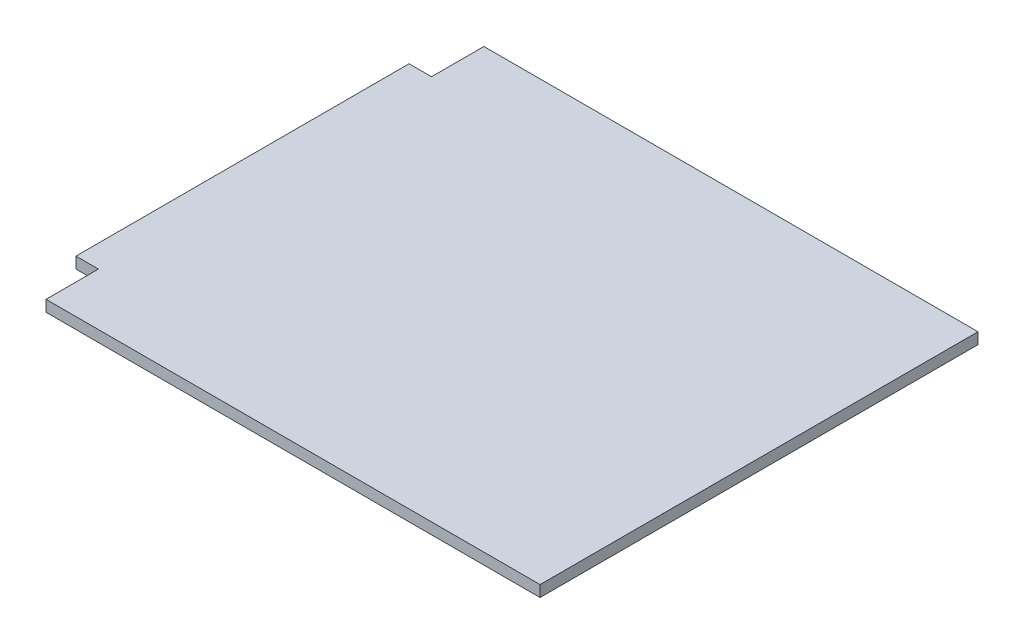
ISO-10303-21;
HEADER;
FILE_DESCRIPTION(('STEP AP214'),'2;1');
FILE_NAME('part.step','',(''),(''),'','','');
FILE_SCHEMA(('AUTOMOTIVE_DESIGN { 1 0 10303 214 1 1 1 1 }'));
ENDSEC;
DATA;
#1=APPLICATION_CONTEXT('core data for automotive mechanical design processes');
#2=APPLICATION_PROTOCOL_DEFINITION('international standard','automotive_design',2000,#1);
#3=PRODUCT_CONTEXT('',#1,'mechanical');
#4=PRODUCT('Part','Part','',(#3));
#5=PRODUCT_RELATED_PRODUCT_CATEGORY('part','',(#4));
#6=PRODUCT_DEFINITION_FORMATION('','',#4);
#7=PRODUCT_DEFINITION_CONTEXT('part definition',#1,'design');
#8=PRODUCT_DEFINITION('design','',#6,#7);
#9=PRODUCT_DEFINITION_SHAPE('','',#8);
#10=(LENGTH_UNIT() NAMED_UNIT(*) SI_UNIT(.MILLI.,.METRE.));
#11=(NAMED_UNIT(*) PLANE_ANGLE_UNIT() SI_UNIT($,.RADIAN.));
#12=(NAMED_UNIT(*) SI_UNIT($,.STERADIAN.) SOLID_ANGLE_UNIT());
#13=UNCERTAINTY_MEASURE_WITH_UNIT(LENGTH_MEASURE(1.E-05),#10,'distance_accuracy_value','');
#14=(GEOMETRIC_REPRESENTATION_CONTEXT(3) GLOBAL_UNCERTAINTY_ASSIGNED_CONTEXT((#13)) GLOBAL_UNIT_ASSIGNED_CONTEXT((#10,
#11,#12)) REPRESENTATION_CONTEXT('',''));
#15=CARTESIAN_POINT('',(0.,0.,0.));
#16=DIRECTION('',(0.,0.,1.));
#17=DIRECTION('',(1.,0.,0.));
#18=AXIS2_PLACEMENT_3D('',#15,#16,#17);
#19=CARTESIAN_POINT('',(0.,19.05,565.15));
#20=DIRECTION('',(1.,0.,0.));
#21=DIRECTION('',(0.,0.,-1.));
#22=AXIS2_PLACEMENT_3D('',#19,#20,#21);
#23=PLANE('',#22);
#24=DIRECTION('',(0.,0.,1.));
#25=VECTOR('',#24,1.);
#26=CARTESIAN_POINT('',(0.,0.,565.15));
#27=LINE('',#26,#25);
#28=CARTESIAN_POINT('',(0.,0.,0.));
#29=VERTEX_POINT('',#28);
#30=CARTESIAN_POINT('',(0.,0.,565.15));
#31=VERTEX_POINT('',#30);
#32=EDGE_CURVE('E140',#29,#31,#27,.T.);
#33=ORIENTED_EDGE('',*,*,#32,.T.);
#34=DIRECTION('',(0.,-1.,0.));
#35=VECTOR('',#34,1.);
#36=CARTESIAN_POINT('',(0.,19.05,565.15));
#37=LINE('',#36,#35);
#38=CARTESIAN_POINT('',(0.,19.05,565.15));
#39=VERTEX_POINT('',#38);
#40=EDGE_CURVE('E11',#39,#31,#37,.T.);
#41=ORIENTED_EDGE('',*,*,#40,.F.);
#42=DIRECTION('',(0.,0.,1.));
#43=VECTOR('',#42,1.);
#44=CARTESIAN_POINT('',(0.,19.05,565.15));
#45=LINE('',#44,#43);
#46=CARTESIAN_POINT('',(0.,19.05,0.));
#47=VERTEX_POINT('',#46);
#48=EDGE_CURVE('E162',#47,#39,#45,.T.);
#49=ORIENTED_EDGE('',*,*,#48,.F.);
#50=DIRECTION('',(0.,-1.,0.));
#51=VECTOR('',#50,1.);
#52=CARTESIAN_POINT('',(0.,19.05,0.));
#53=LINE('',#52,#51);
#54=EDGE_CURVE('E136',#47,#29,#53,.T.);
#55=ORIENTED_EDGE('',*,*,#54,.T.);
#56=EDGE_LOOP('',(#33,#41,#49,#55));
#57=FACE_BOUND('',#56,.T.);
#58=ADVANCED_FACE('F39',(#57),#23,.F.);
#59=CARTESIAN_POINT('',(38.1,19.05,565.15));
#60=DIRECTION('',(0.,0.,-1.));
#61=DIRECTION('',(-1.,0.,0.));
#62=AXIS2_PLACEMENT_3D('',#59,#60,#61);
#63=PLANE('',#62);
#64=DIRECTION('',(1.,0.,0.));
#65=VECTOR('',#64,1.);
#66=CARTESIAN_POINT('',(38.1,0.,565.15));
#67=LINE('',#66,#65);
#68=CARTESIAN_POINT('',(38.1,0.,565.15));
#69=VERTEX_POINT('',#68);
#70=EDGE_CURVE('E144',#31,#69,#67,.T.);
#71=ORIENTED_EDGE('',*,*,#70,.T.);
#72=DIRECTION('',(0.,-1.,0.));
#73=VECTOR('',#72,1.);
#74=CARTESIAN_POINT('',(38.1,19.05,565.15));
#75=LINE('',#74,#73);
#76=CARTESIAN_POINT('',(38.1,19.05,565.15));
#77=VERTEX_POINT('',#76);
#78=EDGE_CURVE('E48',#77,#69,#75,.T.);
#79=ORIENTED_EDGE('',*,*,#78,.F.);
#80=DIRECTION('',(1.,0.,0.));
#81=VECTOR('',#80,1.);
#82=CARTESIAN_POINT('',(38.1,19.05,565.15));
#83=LINE('',#82,#81);
#84=EDGE_CURVE('E99',#39,#77,#83,.T.);
#85=ORIENTED_EDGE('',*,*,#84,.F.);
#86=ORIENTED_EDGE('',*,*,#40,.T.);
#87=EDGE_LOOP('',(#71,#79,#85,#86));
#88=FACE_BOUND('',#87,.T.);
#89=ADVANCED_FACE('F208',(#88),#63,.F.);
#90=CARTESIAN_POINT('',(38.1,19.05,654.05));
#91=DIRECTION('',(1.,0.,0.));
#92=DIRECTION('',(0.,0.,-1.));
#93=AXIS2_PLACEMENT_3D('',#90,#91,#92);
#94=PLANE('',#93);
#95=DIRECTION('',(0.,0.,1.));
#96=VECTOR('',#95,1.);
#97=CARTESIAN_POINT('',(38.1,0.,654.05));
#98=LINE('',#97,#96);
#99=CARTESIAN_POINT('',(38.1,0.,654.05));
#100=VERTEX_POINT('',#99);
#101=EDGE_CURVE('E147',#69,#100,#98,.T.);
#102=ORIENTED_EDGE('',*,*,#101,.T.);
#103=DIRECTION('',(0.,-1.,0.));
#104=VECTOR('',#103,1.);
#105=CARTESIAN_POINT('',(38.1,19.05,654.05));
#106=LINE('',#105,#104);
#107=CARTESIAN_POINT('',(38.1,19.05,654.05));
#108=VERTEX_POINT('',#107);
#109=EDGE_CURVE('E173',#108,#100,#106,.T.);
#110=ORIENTED_EDGE('',*,*,#109,.F.);
#111=DIRECTION('',(0.,0.,1.));
#112=VECTOR('',#111,1.);
#113=CARTESIAN_POINT('',(38.1,19.05,654.05));
#114=LINE('',#113,#112);
#115=EDGE_CURVE('E183',#77,#108,#114,.T.);
#116=ORIENTED_EDGE('',*,*,#115,.F.);
#117=ORIENTED_EDGE('',*,*,#78,.T.);
#118=EDGE_LOOP('',(#102,#110,#116,#117));
#119=FACE_BOUND('',#118,.T.);
#120=ADVANCED_FACE('F181',(#119),#94,.F.);
#121=CARTESIAN_POINT('',(876.3,19.05,654.05));
#122=DIRECTION('',(0.,0.,-1.));
#123=DIRECTION('',(-1.,0.,0.));
#124=AXIS2_PLACEMENT_3D('',#121,#122,#123);
#125=PLANE('',#124);
#126=DIRECTION('',(1.,0.,0.));
#127=VECTOR('',#126,1.);
#128=CARTESIAN_POINT('',(876.3,0.,654.05));
#129=LINE('',#128,#127);
#130=CARTESIAN_POINT('',(876.3,0.,654.05));
#131=VERTEX_POINT('',#130);
#132=EDGE_CURVE('E150',#100,#131,#129,.T.);
#133=ORIENTED_EDGE('',*,*,#132,.T.);
#134=DIRECTION('',(0.,-1.,0.));
#135=VECTOR('',#134,1.);
#136=CARTESIAN_POINT('',(876.3,19.05,654.05));
#137=LINE('',#136,#135);
#138=CARTESIAN_POINT('',(876.3,19.05,654.05));
#139=VERTEX_POINT('',#138);
#140=EDGE_CURVE('E169',#139,#131,#137,.T.);
#141=ORIENTED_EDGE('',*,*,#140,.F.);
#142=DIRECTION('',(1.,0.,0.));
#143=VECTOR('',#142,1.);
#144=CARTESIAN_POINT('',(876.3,19.05,654.05));
#145=LINE('',#144,#143);
#146=EDGE_CURVE('E196',#108,#139,#145,.T.);
#147=ORIENTED_EDGE('',*,*,#146,.F.);
#148=ORIENTED_EDGE('',*,*,#109,.T.);
#149=EDGE_LOOP('',(#133,#141,#147,#148));
#150=FACE_BOUND('',#149,.T.);
#151=ADVANCED_FACE('F191',(#150),#125,.F.);
#152=CARTESIAN_POINT('',(876.3,19.05,-88.9));
#153=DIRECTION('',(-1.,0.,0.));
#154=DIRECTION('',(0.,0.,1.));
#155=AXIS2_PLACEMENT_3D('',#152,#153,#154);
#156=PLANE('',#155);
#157=DIRECTION('',(0.,0.,-1.));
#158=VECTOR('',#157,1.);
#159=CARTESIAN_POINT('',(876.3,0.,-88.9));
#160=LINE('',#159,#158);
#161=CARTESIAN_POINT('',(876.3,0.,-88.9));
#162=VERTEX_POINT('',#161);
#163=EDGE_CURVE('E153',#131,#162,#160,.T.);
#164=ORIENTED_EDGE('',*,*,#163,.T.);
#165=DIRECTION('',(0.,-1.,0.));
#166=VECTOR('',#165,1.);
#167=CARTESIAN_POINT('',(876.3,19.05,-88.9));
#168=LINE('',#167,#166);
#169=CARTESIAN_POINT('',(876.3,19.05,-88.9));
#170=VERTEX_POINT('',#169);
#171=EDGE_CURVE('E129',#170,#162,#168,.T.);
#172=ORIENTED_EDGE('',*,*,#171,.F.);
#173=DIRECTION('',(0.,0.,-1.));
#174=VECTOR('',#173,1.);
#175=CARTESIAN_POINT('',(876.3,19.05,-88.9));
#176=LINE('',#175,#174);
#177=EDGE_CURVE('E118',#139,#170,#176,.T.);
#178=ORIENTED_EDGE('',*,*,#177,.F.);
#179=ORIENTED_EDGE('',*,*,#140,.T.);
#180=EDGE_LOOP('',(#164,#172,#178,#179));
#181=FACE_BOUND('',#180,.T.);
#182=ADVANCED_FACE('F194',(#181),#156,.F.);
#183=CARTESIAN_POINT('',(38.1,19.05,-88.9));
#184=DIRECTION('',(0.,0.,1.));
#185=DIRECTION('',(1.,0.,0.));
#186=AXIS2_PLACEMENT_3D('',#183,#184,#185);
#187=PLANE('',#186);
#188=DIRECTION('',(-1.,0.,0.));
#189=VECTOR('',#188,1.);
#190=CARTESIAN_POINT('',(38.1,0.,-88.9));
#191=LINE('',#190,#189);
#192=CARTESIAN_POINT('',(38.1,0.,-88.9));
#193=VERTEX_POINT('',#192);
#194=EDGE_CURVE('E127',#162,#193,#191,.T.);
#195=ORIENTED_EDGE('',*,*,#194,.T.);
#196=DIRECTION('',(0.,-1.,0.));
#197=VECTOR('',#196,1.);
#198=CARTESIAN_POINT('',(38.1,19.05,-88.9));
#199=LINE('',#198,#197);
#200=CARTESIAN_POINT('',(38.1,19.05,-88.9));
#201=VERTEX_POINT('',#200);
#202=EDGE_CURVE('E124',#201,#193,#199,.T.);
#203=ORIENTED_EDGE('',*,*,#202,.F.);
#204=DIRECTION('',(-1.,0.,0.));
#205=VECTOR('',#204,1.);
#206=CARTESIAN_POINT('',(38.1,19.05,-88.9));
#207=LINE('',#206,#205);
#208=EDGE_CURVE('E112',#170,#201,#207,.T.);
#209=ORIENTED_EDGE('',*,*,#208,.F.);
#210=ORIENTED_EDGE('',*,*,#171,.T.);
#211=EDGE_LOOP('',(#195,#203,#209,#210));
#212=FACE_BOUND('',#211,.T.);
#213=ADVANCED_FACE('F125',(#212),#187,.F.);
#214=CARTESIAN_POINT('',(38.1,19.05,0.));
#215=DIRECTION('',(1.,0.,0.));
#216=DIRECTION('',(0.,0.,-1.));
#217=AXIS2_PLACEMENT_3D('',#214,#215,#216);
#218=PLANE('',#217);
#219=DIRECTION('',(0.,0.,1.));
#220=VECTOR('',#219,1.);
#221=CARTESIAN_POINT('',(38.1,0.,0.));
#222=LINE('',#221,#220);
#223=CARTESIAN_POINT('',(38.1,0.,0.));
#224=VERTEX_POINT('',#223);
#225=EDGE_CURVE('E85',#193,#224,#222,.T.);
#226=ORIENTED_EDGE('',*,*,#225,.T.);
#227=DIRECTION('',(0.,-1.,0.));
#228=VECTOR('',#227,1.);
#229=CARTESIAN_POINT('',(38.1,19.05,0.));
#230=LINE('',#229,#228);
#231=CARTESIAN_POINT('',(38.1,19.05,0.));
#232=VERTEX_POINT('',#231);
#233=EDGE_CURVE('E130',#232,#224,#230,.T.);
#234=ORIENTED_EDGE('',*,*,#233,.F.);
#235=DIRECTION('',(0.,0.,1.));
#236=VECTOR('',#235,1.);
#237=CARTESIAN_POINT('',(38.1,19.05,0.));
#238=LINE('',#237,#236);
#239=EDGE_CURVE('E116',#201,#232,#238,.T.);
#240=ORIENTED_EDGE('',*,*,#239,.F.);
#241=ORIENTED_EDGE('',*,*,#202,.T.);
#242=EDGE_LOOP('',(#226,#234,#240,#241));
#243=FACE_BOUND('',#242,.T.);
#244=ADVANCED_FACE('F132',(#243),#218,.F.);
#245=CARTESIAN_POINT('',(0.,19.05,0.));
#246=DIRECTION('',(0.,0.,1.));
#247=DIRECTION('',(1.,0.,0.));
#248=AXIS2_PLACEMENT_3D('',#245,#246,#247);
#249=PLANE('',#248);
#250=DIRECTION('',(-1.,0.,0.));
#251=VECTOR('',#250,1.);
#252=CARTESIAN_POINT('',(0.,0.,0.));
#253=LINE('',#252,#251);
#254=EDGE_CURVE('E91',#224,#29,#253,.T.);
#255=ORIENTED_EDGE('',*,*,#254,.T.);
#256=ORIENTED_EDGE('',*,*,#54,.F.);
#257=DIRECTION('',(-1.,0.,0.));
#258=VECTOR('',#257,1.);
#259=CARTESIAN_POINT('',(0.,19.05,0.));
#260=LINE('',#259,#258);
#261=EDGE_CURVE('E56',#232,#47,#260,.T.);
#262=ORIENTED_EDGE('',*,*,#261,.F.);
#263=ORIENTED_EDGE('',*,*,#233,.T.);
#264=EDGE_LOOP('',(#255,#256,#262,#263));
#265=FACE_BOUND('',#264,.T.);
#266=ADVANCED_FACE('F224',(#265),#249,.F.);
#267=CARTESIAN_POINT('',(0.,19.05,0.));
#268=DIRECTION('',(0.,-1.,0.));
#269=DIRECTION('',(0.,0.,-1.));
#270=AXIS2_PLACEMENT_3D('',#267,#268,#269);
#271=PLANE('',#270);
#272=ORIENTED_EDGE('',*,*,#48,.T.);
#273=ORIENTED_EDGE('',*,*,#84,.T.);
#274=ORIENTED_EDGE('',*,*,#115,.T.);
#275=ORIENTED_EDGE('',*,*,#146,.T.);
#276=ORIENTED_EDGE('',*,*,#177,.T.);
#277=ORIENTED_EDGE('',*,*,#208,.T.);
#278=ORIENTED_EDGE('',*,*,#239,.T.);
#279=ORIENTED_EDGE('',*,*,#261,.T.);
#280=EDGE_LOOP('',(#272,#273,#274,#275,#276,#277,#278,#279));
#281=FACE_BOUND('',#280,.T.);
#282=ADVANCED_FACE('F114',(#281),#271,.F.);
#283=CARTESIAN_POINT('',(0.,0.,0.));
#284=DIRECTION('',(0.,-1.,0.));
#285=DIRECTION('',(0.,0.,-1.));
#286=AXIS2_PLACEMENT_3D('',#283,#284,#285);
#287=PLANE('',#286);
#288=ORIENTED_EDGE('',*,*,#32,.F.);
#289=ORIENTED_EDGE('',*,*,#254,.F.);
#290=ORIENTED_EDGE('',*,*,#225,.F.);
#291=ORIENTED_EDGE('',*,*,#194,.F.);
#292=ORIENTED_EDGE('',*,*,#163,.F.);
#293=ORIENTED_EDGE('',*,*,#132,.F.);
#294=ORIENTED_EDGE('',*,*,#101,.F.);
#295=ORIENTED_EDGE('',*,*,#70,.F.);
#296=EDGE_LOOP('',(#288,#289,#290,#291,#292,#293,#294,#295));
#297=FACE_BOUND('',#296,.T.);
#298=ADVANCED_FACE('F187',(#297),#287,.T.);
#299=CLOSED_SHELL('',(#58,#89,#120,#151,#182,#213,#244,#266,#282,#298));
#300=MANIFOLD_SOLID_BREP('B2',#299);
#301=ADVANCED_BREP_SHAPE_REPRESENTATION('',(#18,#300),#14);
#302=SHAPE_DEFINITION_REPRESENTATION(#9,#301);
ENDSEC;
END-ISO-10303-21;
